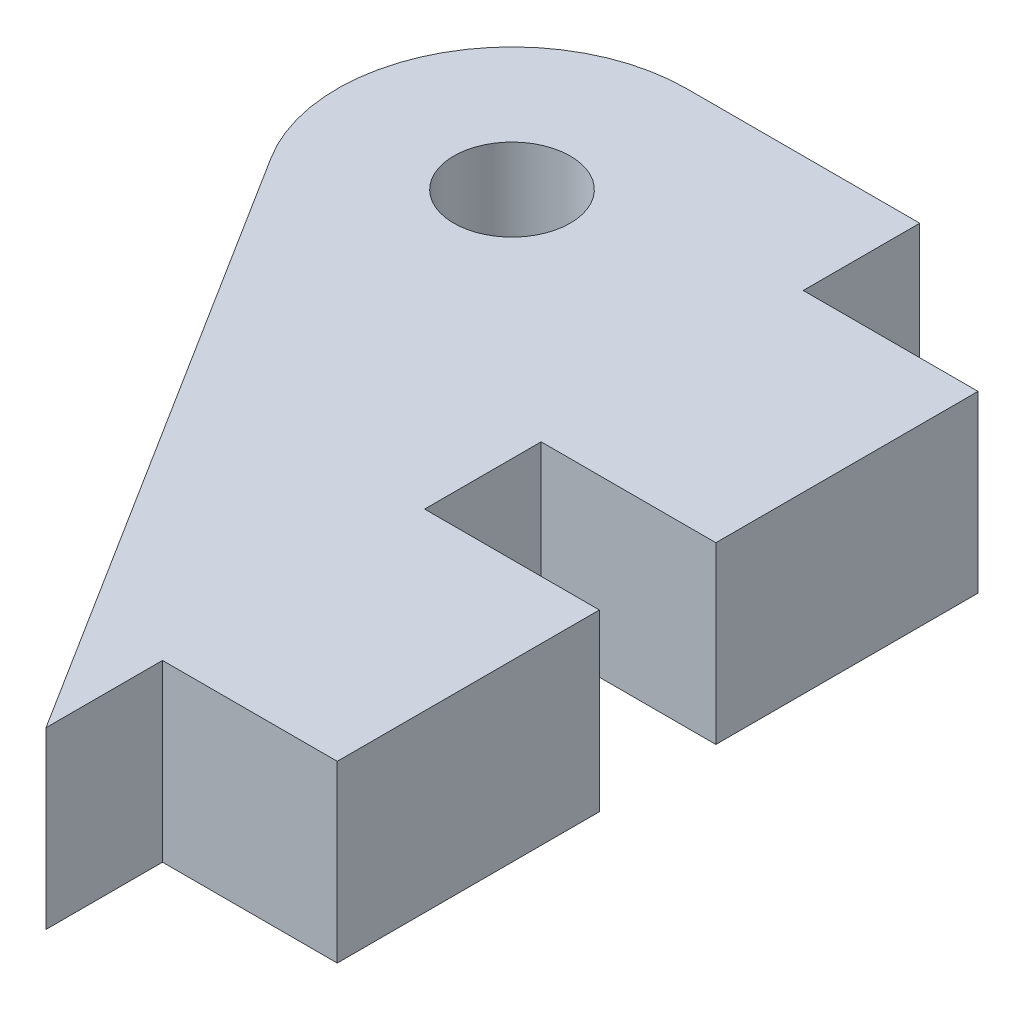
ISO-10303-21;
HEADER;
FILE_DESCRIPTION(('STEP AP214'),'2;1');
FILE_NAME('part.step','',(''),(''),'','','');
FILE_SCHEMA(('AUTOMOTIVE_DESIGN { 1 0 10303 214 1 1 1 1 }'));
ENDSEC;
DATA;
#1=APPLICATION_CONTEXT('core data for automotive mechanical design processes');
#2=APPLICATION_PROTOCOL_DEFINITION('international standard','automotive_design',2000,#1);
#3=PRODUCT_CONTEXT('',#1,'mechanical');
#4=PRODUCT('Part','Part','',(#3));
#5=PRODUCT_RELATED_PRODUCT_CATEGORY('part','',(#4));
#6=PRODUCT_DEFINITION_FORMATION('','',#4);
#7=PRODUCT_DEFINITION_CONTEXT('part definition',#1,'design');
#8=PRODUCT_DEFINITION('design','',#6,#7);
#9=PRODUCT_DEFINITION_SHAPE('','',#8);
#10=(LENGTH_UNIT() NAMED_UNIT(*) SI_UNIT(.MILLI.,.METRE.));
#11=(NAMED_UNIT(*) PLANE_ANGLE_UNIT() SI_UNIT($,.RADIAN.));
#12=(NAMED_UNIT(*) SI_UNIT($,.STERADIAN.) SOLID_ANGLE_UNIT());
#13=UNCERTAINTY_MEASURE_WITH_UNIT(LENGTH_MEASURE(1.E-05),#10,'distance_accuracy_value','');
#14=(GEOMETRIC_REPRESENTATION_CONTEXT(3) GLOBAL_UNCERTAINTY_ASSIGNED_CONTEXT((#13)) GLOBAL_UNIT_ASSIGNED_CONTEXT((#10,
#11,#12)) REPRESENTATION_CONTEXT('',''));
#15=CARTESIAN_POINT('',(0.,0.,0.));
#16=DIRECTION('',(0.,0.,1.));
#17=DIRECTION('',(1.,0.,0.));
#18=AXIS2_PLACEMENT_3D('',#15,#16,#17);
#19=CARTESIAN_POINT('',(-1.5,0.,-2.25));
#20=DIRECTION('',(0.,1.,0.));
#21=DIRECTION('',(0.,0.,1.));
#22=AXIS2_PLACEMENT_3D('',#19,#20,#21);
#23=PLANE('',#22);
#24=DIRECTION('',(-1.,0.,0.));
#25=VECTOR('',#24,1.);
#26=CARTESIAN_POINT('',(0.,0.,-4.5));
#27=LINE('',#26,#25);
#28=CARTESIAN_POINT('',(0.,0.,-4.5));
#29=VERTEX_POINT('',#28);
#30=CARTESIAN_POINT('',(-3.,0.,-4.5));
#31=VERTEX_POINT('',#30);
#32=EDGE_CURVE('E19',#29,#31,#27,.T.);
#33=ORIENTED_EDGE('',*,*,#32,.F.);
#34=DIRECTION('',(0.,0.,-1.));
#35=VECTOR('',#34,1.);
#36=CARTESIAN_POINT('',(0.,0.,0.));
#37=LINE('',#36,#35);
#38=CARTESIAN_POINT('',(0.,0.,0.));
#39=VERTEX_POINT('',#38);
#40=EDGE_CURVE('E148',#39,#29,#37,.T.);
#41=ORIENTED_EDGE('',*,*,#40,.F.);
#42=DIRECTION('',(1.,0.,0.));
#43=VECTOR('',#42,1.);
#44=CARTESIAN_POINT('',(-3.,0.,0.));
#45=LINE('',#44,#43);
#46=CARTESIAN_POINT('',(-3.,0.,0.));
#47=VERTEX_POINT('',#46);
#48=EDGE_CURVE('E25',#47,#39,#45,.T.);
#49=ORIENTED_EDGE('',*,*,#48,.F.);
#50=DIRECTION('',(0.,0.,1.));
#51=VECTOR('',#50,1.);
#52=CARTESIAN_POINT('',(-3.,0.,8.5));
#53=LINE('',#52,#51);
#54=CARTESIAN_POINT('',(-3.,0.,2.));
#55=VERTEX_POINT('',#54);
#56=EDGE_CURVE('E131',#47,#55,#53,.T.);
#57=ORIENTED_EDGE('',*,*,#56,.T.);
#58=DIRECTION('',(-1.,0.,0.));
#59=VECTOR('',#58,1.);
#60=CARTESIAN_POINT('',(0.,0.,2.));
#61=LINE('',#60,#59);
#62=CARTESIAN_POINT('',(0.,0.,2.));
#63=VERTEX_POINT('',#62);
#64=EDGE_CURVE('E123',#63,#55,#61,.T.);
#65=ORIENTED_EDGE('',*,*,#64,.F.);
#66=DIRECTION('',(0.,0.,-1.));
#67=VECTOR('',#66,1.);
#68=CARTESIAN_POINT('',(0.,0.,6.5));
#69=LINE('',#68,#67);
#70=CARTESIAN_POINT('',(0.,0.,6.5));
#71=VERTEX_POINT('',#70);
#72=EDGE_CURVE('E221',#71,#63,#69,.T.);
#73=ORIENTED_EDGE('',*,*,#72,.F.);
#74=DIRECTION('',(1.,0.,0.));
#75=VECTOR('',#74,1.);
#76=CARTESIAN_POINT('',(-3.,0.,6.5));
#77=LINE('',#76,#75);
#78=CARTESIAN_POINT('',(-3.,0.,6.5));
#79=VERTEX_POINT('',#78);
#80=EDGE_CURVE('E154',#79,#71,#77,.T.);
#81=ORIENTED_EDGE('',*,*,#80,.F.);
#82=DIRECTION('',(0.,0.,1.));
#83=VECTOR('',#82,1.);
#84=CARTESIAN_POINT('',(-3.,0.,8.5));
#85=LINE('',#84,#83);
#86=CARTESIAN_POINT('',(-3.,0.,8.5));
#87=VERTEX_POINT('',#86);
#88=EDGE_CURVE('E141',#79,#87,#85,.T.);
#89=ORIENTED_EDGE('',*,*,#88,.T.);
#90=DIRECTION('',(-0.532205143186113,0.,-0.846615429558338));
#91=VECTOR('',#90,1.);
#92=CARTESIAN_POINT('',(-9.53984628867502,0.,-1.90338457044166));
#93=LINE('',#92,#91);
#94=CARTESIAN_POINT('',(-9.53984628867502,0.,-1.90338457044166));
#95=VERTEX_POINT('',#94);
#96=EDGE_CURVE('E152',#87,#95,#93,.T.);
#97=ORIENTED_EDGE('',*,*,#96,.T.);
#98=CARTESIAN_POINT('',(-7.,0.,-3.5));
#99=DIRECTION('',(0.,-1.,0.));
#100=DIRECTION('',(0.,0.,-1.));
#101=AXIS2_PLACEMENT_3D('',#98,#99,#100);
#102=CIRCLE('',#101,3.);
#103=CARTESIAN_POINT('',(-7.,0.,-6.5));
#104=VERTEX_POINT('',#103);
#105=EDGE_CURVE('E170',#95,#104,#102,.T.);
#106=ORIENTED_EDGE('',*,*,#105,.T.);
#107=DIRECTION('',(1.,0.,0.));
#108=VECTOR('',#107,1.);
#109=CARTESIAN_POINT('',(-3.,0.,-6.5));
#110=LINE('',#109,#108);
#111=CARTESIAN_POINT('',(-3.,0.,-6.5));
#112=VERTEX_POINT('',#111);
#113=EDGE_CURVE('E165',#104,#112,#110,.T.);
#114=ORIENTED_EDGE('',*,*,#113,.T.);
#115=DIRECTION('',(0.,0.,1.));
#116=VECTOR('',#115,1.);
#117=CARTESIAN_POINT('',(-3.,0.,8.5));
#118=LINE('',#117,#116);
#119=EDGE_CURVE('E177',#112,#31,#118,.T.);
#120=ORIENTED_EDGE('',*,*,#119,.T.);
#121=EDGE_LOOP('',(#33,#41,#49,#57,#65,#73,#81,#89,#97,#106,#114,#120));
#122=FACE_BOUND('',#121,.T.);
#123=CARTESIAN_POINT('',(-7.,0.,-3.5));
#124=DIRECTION('',(0.,1.,0.));
#125=DIRECTION('',(1.,0.,0.));
#126=AXIS2_PLACEMENT_3D('',#123,#124,#125);
#127=CIRCLE('',#126,1.);
#128=CARTESIAN_POINT('',(-6.,0.,-3.5));
#129=VERTEX_POINT('',#128);
#130=EDGE_CURVE('E178',#129,#129,#127,.T.);
#131=ORIENTED_EDGE('',*,*,#130,.T.);
#132=EDGE_LOOP('',(#131));
#133=FACE_BOUND('',#132,.T.);
#134=ADVANCED_FACE('F15',(#122,#133),#23,.F.);
#135=CARTESIAN_POINT('',(-1.5,3.,-2.25));
#136=DIRECTION('',(0.,1.,0.));
#137=DIRECTION('',(0.,0.,1.));
#138=AXIS2_PLACEMENT_3D('',#135,#136,#137);
#139=PLANE('',#138);
#140=DIRECTION('',(1.,0.,0.));
#141=VECTOR('',#140,1.);
#142=CARTESIAN_POINT('',(-3.,3.,0.));
#143=LINE('',#142,#141);
#144=CARTESIAN_POINT('',(-3.,3.,0.));
#145=VERTEX_POINT('',#144);
#146=CARTESIAN_POINT('',(0.,3.,0.));
#147=VERTEX_POINT('',#146);
#148=EDGE_CURVE('E10',#145,#147,#143,.T.);
#149=ORIENTED_EDGE('',*,*,#148,.T.);
#150=DIRECTION('',(0.,0.,-1.));
#151=VECTOR('',#150,1.);
#152=CARTESIAN_POINT('',(0.,3.,0.));
#153=LINE('',#152,#151);
#154=CARTESIAN_POINT('',(0.,3.,-4.5));
#155=VERTEX_POINT('',#154);
#156=EDGE_CURVE('E159',#147,#155,#153,.T.);
#157=ORIENTED_EDGE('',*,*,#156,.T.);
#158=DIRECTION('',(-1.,0.,0.));
#159=VECTOR('',#158,1.);
#160=CARTESIAN_POINT('',(0.,3.,-4.5));
#161=LINE('',#160,#159);
#162=CARTESIAN_POINT('',(-3.,3.,-4.5));
#163=VERTEX_POINT('',#162);
#164=EDGE_CURVE('E149',#155,#163,#161,.T.);
#165=ORIENTED_EDGE('',*,*,#164,.T.);
#166=DIRECTION('',(0.,0.,-1.));
#167=VECTOR('',#166,1.);
#168=CARTESIAN_POINT('',(-3.,3.,8.5));
#169=LINE('',#168,#167);
#170=CARTESIAN_POINT('',(-3.,3.,-6.5));
#171=VERTEX_POINT('',#170);
#172=EDGE_CURVE('E166',#163,#171,#169,.T.);
#173=ORIENTED_EDGE('',*,*,#172,.T.);
#174=DIRECTION('',(-1.,0.,0.));
#175=VECTOR('',#174,1.);
#176=CARTESIAN_POINT('',(-3.,3.,-6.5));
#177=LINE('',#176,#175);
#178=CARTESIAN_POINT('',(-7.,3.,-6.5));
#179=VERTEX_POINT('',#178);
#180=EDGE_CURVE('E161',#171,#179,#177,.T.);
#181=ORIENTED_EDGE('',*,*,#180,.T.);
#182=CARTESIAN_POINT('',(-7.,3.,-3.5));
#183=DIRECTION('',(0.,1.,0.));
#184=DIRECTION('',(0.,0.,-1.));
#185=AXIS2_PLACEMENT_3D('',#182,#183,#184);
#186=CIRCLE('',#185,3.);
#187=CARTESIAN_POINT('',(-9.53984628867502,3.,-1.90338457044166));
#188=VERTEX_POINT('',#187);
#189=EDGE_CURVE('E173',#179,#188,#186,.T.);
#190=ORIENTED_EDGE('',*,*,#189,.T.);
#191=DIRECTION('',(0.532205143186113,0.,0.846615429558338));
#192=VECTOR('',#191,1.);
#193=CARTESIAN_POINT('',(-9.53984628867502,3.,-1.90338457044166));
#194=LINE('',#193,#192);
#195=CARTESIAN_POINT('',(-3.,3.,8.5));
#196=VERTEX_POINT('',#195);
#197=EDGE_CURVE('E150',#188,#196,#194,.T.);
#198=ORIENTED_EDGE('',*,*,#197,.T.);
#199=DIRECTION('',(0.,0.,-1.));
#200=VECTOR('',#199,1.);
#201=CARTESIAN_POINT('',(-3.,3.,8.5));
#202=LINE('',#201,#200);
#203=CARTESIAN_POINT('',(-3.,3.,6.5));
#204=VERTEX_POINT('',#203);
#205=EDGE_CURVE('E184',#196,#204,#202,.T.);
#206=ORIENTED_EDGE('',*,*,#205,.T.);
#207=DIRECTION('',(1.,0.,0.));
#208=VECTOR('',#207,1.);
#209=CARTESIAN_POINT('',(-3.,3.,6.5));
#210=LINE('',#209,#208);
#211=CARTESIAN_POINT('',(0.,3.,6.5));
#212=VERTEX_POINT('',#211);
#213=EDGE_CURVE('E86',#204,#212,#210,.T.);
#214=ORIENTED_EDGE('',*,*,#213,.T.);
#215=DIRECTION('',(0.,0.,-1.));
#216=VECTOR('',#215,1.);
#217=CARTESIAN_POINT('',(0.,3.,6.5));
#218=LINE('',#217,#216);
#219=CARTESIAN_POINT('',(0.,3.,2.));
#220=VERTEX_POINT('',#219);
#221=EDGE_CURVE('E120',#212,#220,#218,.T.);
#222=ORIENTED_EDGE('',*,*,#221,.T.);
#223=DIRECTION('',(-1.,0.,0.));
#224=VECTOR('',#223,1.);
#225=CARTESIAN_POINT('',(0.,3.,2.));
#226=LINE('',#225,#224);
#227=CARTESIAN_POINT('',(-3.,3.,2.));
#228=VERTEX_POINT('',#227);
#229=EDGE_CURVE('E96',#220,#228,#226,.T.);
#230=ORIENTED_EDGE('',*,*,#229,.T.);
#231=DIRECTION('',(0.,0.,-1.));
#232=VECTOR('',#231,1.);
#233=CARTESIAN_POINT('',(-3.,3.,8.5));
#234=LINE('',#233,#232);
#235=EDGE_CURVE('E117',#228,#145,#234,.T.);
#236=ORIENTED_EDGE('',*,*,#235,.T.);
#237=EDGE_LOOP('',(#149,#157,#165,#173,#181,#190,#198,#206,#214,#222,#230,#236));
#238=FACE_BOUND('',#237,.T.);
#239=CARTESIAN_POINT('',(-7.,3.,-3.5));
#240=DIRECTION('',(0.,-1.,0.));
#241=DIRECTION('',(1.,0.,0.));
#242=AXIS2_PLACEMENT_3D('',#239,#240,#241);
#243=CIRCLE('',#242,1.);
#244=CARTESIAN_POINT('',(-6.,3.,-3.5));
#245=VERTEX_POINT('',#244);
#246=EDGE_CURVE('E180',#245,#245,#243,.T.);
#247=ORIENTED_EDGE('',*,*,#246,.T.);
#248=EDGE_LOOP('',(#247));
#249=FACE_BOUND('',#248,.T.);
#250=ADVANCED_FACE('F114',(#238,#249),#139,.T.);
#251=CARTESIAN_POINT('',(-3.,0.,0.));
#252=DIRECTION('',(0.,0.,1.));
#253=DIRECTION('',(1.,0.,0.));
#254=AXIS2_PLACEMENT_3D('',#251,#252,#253);
#255=PLANE('',#254);
#256=ORIENTED_EDGE('',*,*,#48,.T.);
#257=DIRECTION('',(0.,1.,0.));
#258=VECTOR('',#257,1.);
#259=CARTESIAN_POINT('',(0.,0.,0.));
#260=LINE('',#259,#258);
#261=EDGE_CURVE('E195',#39,#147,#260,.T.);
#262=ORIENTED_EDGE('',*,*,#261,.T.);
#263=ORIENTED_EDGE('',*,*,#148,.F.);
#264=DIRECTION('',(0.,1.,0.));
#265=VECTOR('',#264,1.);
#266=CARTESIAN_POINT('',(-3.,0.,0.));
#267=LINE('',#266,#265);
#268=EDGE_CURVE('E134',#47,#145,#267,.T.);
#269=ORIENTED_EDGE('',*,*,#268,.F.);
#270=EDGE_LOOP('',(#256,#262,#263,#269));
#271=FACE_BOUND('',#270,.T.);
#272=ADVANCED_FACE('F270',(#271),#255,.T.);
#273=CARTESIAN_POINT('',(0.,0.,0.));
#274=DIRECTION('',(1.,0.,0.));
#275=DIRECTION('',(0.,0.,-1.));
#276=AXIS2_PLACEMENT_3D('',#273,#274,#275);
#277=PLANE('',#276);
#278=ORIENTED_EDGE('',*,*,#40,.T.);
#279=DIRECTION('',(0.,1.,0.));
#280=VECTOR('',#279,1.);
#281=CARTESIAN_POINT('',(0.,0.,-4.5));
#282=LINE('',#281,#280);
#283=EDGE_CURVE('E145',#29,#155,#282,.T.);
#284=ORIENTED_EDGE('',*,*,#283,.T.);
#285=ORIENTED_EDGE('',*,*,#156,.F.);
#286=ORIENTED_EDGE('',*,*,#261,.F.);
#287=EDGE_LOOP('',(#278,#284,#285,#286));
#288=FACE_BOUND('',#287,.T.);
#289=ADVANCED_FACE('F274',(#288),#277,.T.);
#290=CARTESIAN_POINT('',(0.,0.,-4.5));
#291=DIRECTION('',(0.,0.,-1.));
#292=DIRECTION('',(-1.,0.,0.));
#293=AXIS2_PLACEMENT_3D('',#290,#291,#292);
#294=PLANE('',#293);
#295=ORIENTED_EDGE('',*,*,#32,.T.);
#296=DIRECTION('',(0.,1.,0.));
#297=VECTOR('',#296,1.);
#298=CARTESIAN_POINT('',(-3.,0.,-4.5));
#299=LINE('',#298,#297);
#300=EDGE_CURVE('E174',#31,#163,#299,.T.);
#301=ORIENTED_EDGE('',*,*,#300,.T.);
#302=ORIENTED_EDGE('',*,*,#164,.F.);
#303=ORIENTED_EDGE('',*,*,#283,.F.);
#304=EDGE_LOOP('',(#295,#301,#302,#303));
#305=FACE_BOUND('',#304,.T.);
#306=ADVANCED_FACE('F277',(#305),#294,.T.);
#307=CARTESIAN_POINT('',(0.,0.,2.));
#308=DIRECTION('',(0.,0.,-1.));
#309=DIRECTION('',(-1.,0.,0.));
#310=AXIS2_PLACEMENT_3D('',#307,#308,#309);
#311=PLANE('',#310);
#312=ORIENTED_EDGE('',*,*,#64,.T.);
#313=DIRECTION('',(0.,1.,0.));
#314=VECTOR('',#313,1.);
#315=CARTESIAN_POINT('',(-3.,0.,2.));
#316=LINE('',#315,#314);
#317=EDGE_CURVE('E126',#55,#228,#316,.T.);
#318=ORIENTED_EDGE('',*,*,#317,.T.);
#319=ORIENTED_EDGE('',*,*,#229,.F.);
#320=DIRECTION('',(0.,1.,0.));
#321=VECTOR('',#320,1.);
#322=CARTESIAN_POINT('',(0.,0.,2.));
#323=LINE('',#322,#321);
#324=EDGE_CURVE('E205',#63,#220,#323,.T.);
#325=ORIENTED_EDGE('',*,*,#324,.F.);
#326=EDGE_LOOP('',(#312,#318,#319,#325));
#327=FACE_BOUND('',#326,.T.);
#328=ADVANCED_FACE('F127',(#327),#311,.T.);
#329=CARTESIAN_POINT('',(-3.,0.,6.5));
#330=DIRECTION('',(0.,0.,1.));
#331=DIRECTION('',(1.,0.,0.));
#332=AXIS2_PLACEMENT_3D('',#329,#330,#331);
#333=PLANE('',#332);
#334=ORIENTED_EDGE('',*,*,#80,.T.);
#335=DIRECTION('',(0.,1.,0.));
#336=VECTOR('',#335,1.);
#337=CARTESIAN_POINT('',(0.,0.,6.5));
#338=LINE('',#337,#336);
#339=EDGE_CURVE('E157',#71,#212,#338,.T.);
#340=ORIENTED_EDGE('',*,*,#339,.T.);
#341=ORIENTED_EDGE('',*,*,#213,.F.);
#342=DIRECTION('',(0.,1.,0.));
#343=VECTOR('',#342,1.);
#344=CARTESIAN_POINT('',(-3.,0.,6.5));
#345=LINE('',#344,#343);
#346=EDGE_CURVE('E200',#79,#204,#345,.T.);
#347=ORIENTED_EDGE('',*,*,#346,.F.);
#348=EDGE_LOOP('',(#334,#340,#341,#347));
#349=FACE_BOUND('',#348,.T.);
#350=ADVANCED_FACE('F246',(#349),#333,.T.);
#351=CARTESIAN_POINT('',(0.,0.,6.5));
#352=DIRECTION('',(1.,0.,0.));
#353=DIRECTION('',(0.,0.,-1.));
#354=AXIS2_PLACEMENT_3D('',#351,#352,#353);
#355=PLANE('',#354);
#356=ORIENTED_EDGE('',*,*,#72,.T.);
#357=ORIENTED_EDGE('',*,*,#324,.T.);
#358=ORIENTED_EDGE('',*,*,#221,.F.);
#359=ORIENTED_EDGE('',*,*,#339,.F.);
#360=EDGE_LOOP('',(#356,#357,#358,#359));
#361=FACE_BOUND('',#360,.T.);
#362=ADVANCED_FACE('F254',(#361),#355,.T.);
#363=CARTESIAN_POINT('',(-3.,3.,8.5));
#364=DIRECTION('',(-0.846615429558338,0.,0.532205143186113));
#365=DIRECTION('',(-0.532205143186113,0.,-0.846615429558338));
#366=AXIS2_PLACEMENT_3D('',#363,#364,#365);
#367=PLANE('',#366);
#368=ORIENTED_EDGE('',*,*,#197,.F.);
#369=DIRECTION('',(0.,-1.,0.));
#370=VECTOR('',#369,1.);
#371=CARTESIAN_POINT('',(-9.53984628867502,3.,-1.90338457044166));
#372=LINE('',#371,#370);
#373=EDGE_CURVE('E153',#188,#95,#372,.T.);
#374=ORIENTED_EDGE('',*,*,#373,.T.);
#375=ORIENTED_EDGE('',*,*,#96,.F.);
#376=DIRECTION('',(0.,-1.,0.));
#377=VECTOR('',#376,1.);
#378=CARTESIAN_POINT('',(-3.,3.,8.5));
#379=LINE('',#378,#377);
#380=EDGE_CURVE('E181',#196,#87,#379,.T.);
#381=ORIENTED_EDGE('',*,*,#380,.F.);
#382=EDGE_LOOP('',(#368,#374,#375,#381));
#383=FACE_BOUND('',#382,.T.);
#384=ADVANCED_FACE('F250',(#383),#367,.T.);
#385=CARTESIAN_POINT('',(-7.,3.,-3.5));
#386=DIRECTION('',(0.,1.,0.));
#387=DIRECTION('',(0.,0.,-1.));
#388=AXIS2_PLACEMENT_3D('',#385,#386,#387);
#389=CYLINDRICAL_SURFACE('',#388,3.);
#390=ORIENTED_EDGE('',*,*,#189,.F.);
#391=DIRECTION('',(0.,-1.,0.));
#392=VECTOR('',#391,1.);
#393=CARTESIAN_POINT('',(-7.,3.,-6.5));
#394=LINE('',#393,#392);
#395=EDGE_CURVE('E206',#179,#104,#394,.T.);
#396=ORIENTED_EDGE('',*,*,#395,.T.);
#397=ORIENTED_EDGE('',*,*,#105,.F.);
#398=ORIENTED_EDGE('',*,*,#373,.F.);
#399=EDGE_LOOP('',(#390,#396,#397,#398));
#400=FACE_BOUND('',#399,.T.);
#401=ADVANCED_FACE('F17',(#400),#389,.T.);
#402=CARTESIAN_POINT('',(-7.,3.,-6.5));
#403=DIRECTION('',(0.,0.,-1.));
#404=DIRECTION('',(1.,0.,0.));
#405=AXIS2_PLACEMENT_3D('',#402,#403,#404);
#406=PLANE('',#405);
#407=ORIENTED_EDGE('',*,*,#180,.F.);
#408=DIRECTION('',(0.,-1.,0.));
#409=VECTOR('',#408,1.);
#410=CARTESIAN_POINT('',(-3.,3.,-6.5));
#411=LINE('',#410,#409);
#412=EDGE_CURVE('E185',#171,#112,#411,.T.);
#413=ORIENTED_EDGE('',*,*,#412,.T.);
#414=ORIENTED_EDGE('',*,*,#113,.F.);
#415=ORIENTED_EDGE('',*,*,#395,.F.);
#416=EDGE_LOOP('',(#407,#413,#414,#415));
#417=FACE_BOUND('',#416,.T.);
#418=ADVANCED_FACE('F286',(#417),#406,.T.);
#419=CARTESIAN_POINT('',(-3.,3.,-6.5));
#420=DIRECTION('',(1.,0.,0.));
#421=DIRECTION('',(0.,0.,1.));
#422=AXIS2_PLACEMENT_3D('',#419,#420,#421);
#423=PLANE('',#422);
#424=ORIENTED_EDGE('',*,*,#300,.F.);
#425=ORIENTED_EDGE('',*,*,#119,.F.);
#426=ORIENTED_EDGE('',*,*,#412,.F.);
#427=ORIENTED_EDGE('',*,*,#172,.F.);
#428=EDGE_LOOP('',(#424,#425,#426,#427));
#429=FACE_BOUND('',#428,.T.);
#430=ADVANCED_FACE('F279',(#429),#423,.T.);
#431=CARTESIAN_POINT('',(-3.,3.,-6.5));
#432=DIRECTION('',(1.,0.,0.));
#433=DIRECTION('',(0.,0.,1.));
#434=AXIS2_PLACEMENT_3D('',#431,#432,#433);
#435=PLANE('',#434);
#436=ORIENTED_EDGE('',*,*,#268,.T.);
#437=ORIENTED_EDGE('',*,*,#235,.F.);
#438=ORIENTED_EDGE('',*,*,#317,.F.);
#439=ORIENTED_EDGE('',*,*,#56,.F.);
#440=EDGE_LOOP('',(#436,#437,#438,#439));
#441=FACE_BOUND('',#440,.T.);
#442=ADVANCED_FACE('F133',(#441),#435,.T.);
#443=CARTESIAN_POINT('',(-3.,3.,-6.5));
#444=DIRECTION('',(1.,0.,0.));
#445=DIRECTION('',(0.,0.,1.));
#446=AXIS2_PLACEMENT_3D('',#443,#444,#445);
#447=PLANE('',#446);
#448=ORIENTED_EDGE('',*,*,#346,.T.);
#449=ORIENTED_EDGE('',*,*,#205,.F.);
#450=ORIENTED_EDGE('',*,*,#380,.T.);
#451=ORIENTED_EDGE('',*,*,#88,.F.);
#452=EDGE_LOOP('',(#448,#449,#450,#451));
#453=FACE_BOUND('',#452,.T.);
#454=ADVANCED_FACE('F244',(#453),#447,.T.);
#455=CARTESIAN_POINT('',(-7.,3.,-3.5));
#456=DIRECTION('',(0.,1.,0.));
#457=DIRECTION('',(1.,0.,0.));
#458=AXIS2_PLACEMENT_3D('',#455,#456,#457);
#459=CYLINDRICAL_SURFACE('',#458,1.);
#460=ORIENTED_EDGE('',*,*,#246,.F.);
#461=EDGE_LOOP('',(#460));
#462=FACE_BOUND('',#461,.T.);
#463=ORIENTED_EDGE('',*,*,#130,.F.);
#464=EDGE_LOOP('',(#463));
#465=FACE_BOUND('',#464,.T.);
#466=ADVANCED_FACE('F284',(#462,#465),#459,.F.);
#467=CLOSED_SHELL('',(#134,#250,#272,#289,#306,#328,#350,#362,#384,#401,#418,#430,#442,#454,#466));
#468=MANIFOLD_SOLID_BREP('B1',#467);
#469=ADVANCED_BREP_SHAPE_REPRESENTATION('',(#18,#468),#14);
#470=SHAPE_DEFINITION_REPRESENTATION(#9,#469);
ENDSEC;
END-ISO-10303-21;
